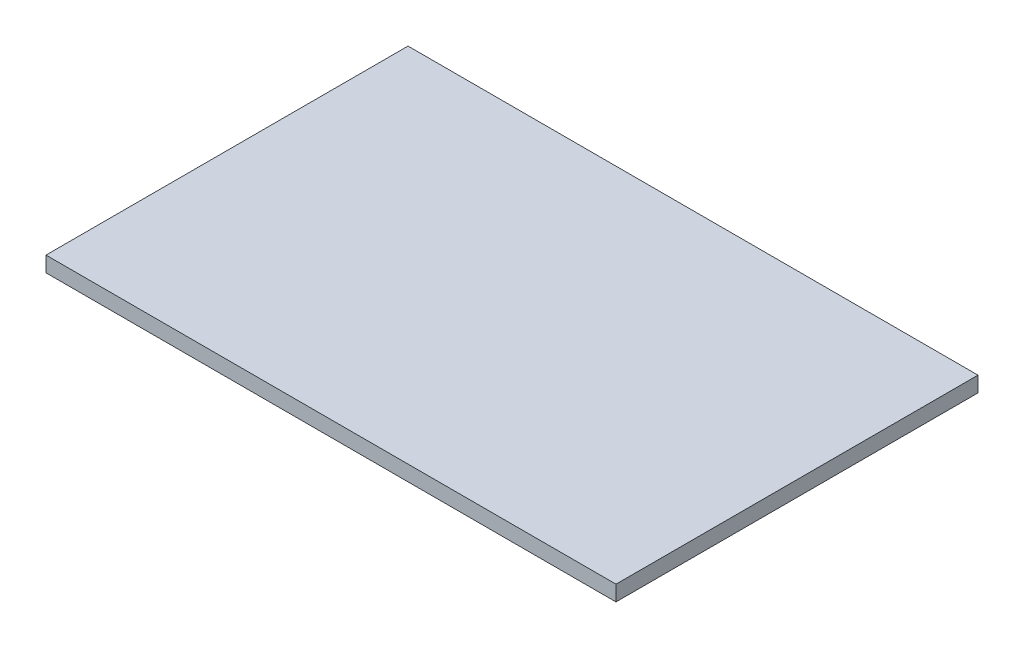
ISO-10303-21;
HEADER;
FILE_DESCRIPTION(('STEP AP214'),'2;1');
FILE_NAME('part.step','',(''),(''),'','','');
FILE_SCHEMA(('AUTOMOTIVE_DESIGN { 1 0 10303 214 1 1 1 1 }'));
ENDSEC;
DATA;
#1=APPLICATION_CONTEXT('core data for automotive mechanical design processes');
#2=APPLICATION_PROTOCOL_DEFINITION('international standard','automotive_design',2000,#1);
#3=PRODUCT_CONTEXT('',#1,'mechanical');
#4=PRODUCT('Part','Part','',(#3));
#5=PRODUCT_RELATED_PRODUCT_CATEGORY('part','',(#4));
#6=PRODUCT_DEFINITION_FORMATION('','',#4);
#7=PRODUCT_DEFINITION_CONTEXT('part definition',#1,'design');
#8=PRODUCT_DEFINITION('design','',#6,#7);
#9=PRODUCT_DEFINITION_SHAPE('','',#8);
#10=(LENGTH_UNIT() NAMED_UNIT(*) SI_UNIT(.MILLI.,.METRE.));
#11=(NAMED_UNIT(*) PLANE_ANGLE_UNIT() SI_UNIT($,.RADIAN.));
#12=(NAMED_UNIT(*) SI_UNIT($,.STERADIAN.) SOLID_ANGLE_UNIT());
#13=UNCERTAINTY_MEASURE_WITH_UNIT(LENGTH_MEASURE(1.E-05),#10,'distance_accuracy_value','');
#14=(GEOMETRIC_REPRESENTATION_CONTEXT(3) GLOBAL_UNCERTAINTY_ASSIGNED_CONTEXT((#13)) GLOBAL_UNIT_ASSIGNED_CONTEXT((#10,
#11,#12)) REPRESENTATION_CONTEXT('',''));
#15=CARTESIAN_POINT('',(0.,0.,0.));
#16=DIRECTION('',(0.,0.,1.));
#17=DIRECTION('',(1.,0.,0.));
#18=AXIS2_PLACEMENT_3D('',#15,#16,#17);
#19=CARTESIAN_POINT('',(-370.,20.,235.));
#20=DIRECTION('',(1.,0.,0.));
#21=DIRECTION('',(0.,0.,-1.));
#22=AXIS2_PLACEMENT_3D('',#19,#20,#21);
#23=PLANE('',#22);
#24=DIRECTION('',(0.,0.,1.));
#25=VECTOR('',#24,1.);
#26=CARTESIAN_POINT('',(-370.,0.,235.));
#27=LINE('',#26,#25);
#28=CARTESIAN_POINT('',(-370.,0.,-235.));
#29=VERTEX_POINT('',#28);
#30=CARTESIAN_POINT('',(-370.,0.,235.));
#31=VERTEX_POINT('',#30);
#32=EDGE_CURVE('E96',#29,#31,#27,.T.);
#33=ORIENTED_EDGE('',*,*,#32,.T.);
#34=DIRECTION('',(0.,-1.,0.));
#35=VECTOR('',#34,1.);
#36=CARTESIAN_POINT('',(-370.,20.,235.));
#37=LINE('',#36,#35);
#38=CARTESIAN_POINT('',(-370.,20.,235.));
#39=VERTEX_POINT('',#38);
#40=EDGE_CURVE('E11',#39,#31,#37,.T.);
#41=ORIENTED_EDGE('',*,*,#40,.F.);
#42=DIRECTION('',(0.,0.,1.));
#43=VECTOR('',#42,1.);
#44=CARTESIAN_POINT('',(-370.,20.,235.));
#45=LINE('',#44,#43);
#46=CARTESIAN_POINT('',(-370.,20.,-235.));
#47=VERTEX_POINT('',#46);
#48=EDGE_CURVE('E84',#47,#39,#45,.T.);
#49=ORIENTED_EDGE('',*,*,#48,.F.);
#50=DIRECTION('',(0.,-1.,0.));
#51=VECTOR('',#50,1.);
#52=CARTESIAN_POINT('',(-370.,20.,-235.));
#53=LINE('',#52,#51);
#54=EDGE_CURVE('E92',#47,#29,#53,.T.);
#55=ORIENTED_EDGE('',*,*,#54,.T.);
#56=EDGE_LOOP('',(#33,#41,#49,#55));
#57=FACE_BOUND('',#56,.T.);
#58=ADVANCED_FACE('F33',(#57),#23,.F.);
#59=CARTESIAN_POINT('',(370.,20.,235.));
#60=DIRECTION('',(0.,0.,-1.));
#61=DIRECTION('',(-1.,0.,0.));
#62=AXIS2_PLACEMENT_3D('',#59,#60,#61);
#63=PLANE('',#62);
#64=DIRECTION('',(1.,0.,0.));
#65=VECTOR('',#64,1.);
#66=CARTESIAN_POINT('',(370.,0.,235.));
#67=LINE('',#66,#65);
#68=CARTESIAN_POINT('',(370.,0.,235.));
#69=VERTEX_POINT('',#68);
#70=EDGE_CURVE('E88',#31,#69,#67,.T.);
#71=ORIENTED_EDGE('',*,*,#70,.T.);
#72=DIRECTION('',(0.,-1.,0.));
#73=VECTOR('',#72,1.);
#74=CARTESIAN_POINT('',(370.,20.,235.));
#75=LINE('',#74,#73);
#76=CARTESIAN_POINT('',(370.,20.,235.));
#77=VERTEX_POINT('',#76);
#78=EDGE_CURVE('E41',#77,#69,#75,.T.);
#79=ORIENTED_EDGE('',*,*,#78,.F.);
#80=DIRECTION('',(1.,0.,0.));
#81=VECTOR('',#80,1.);
#82=CARTESIAN_POINT('',(370.,20.,235.));
#83=LINE('',#82,#81);
#84=EDGE_CURVE('E79',#39,#77,#83,.T.);
#85=ORIENTED_EDGE('',*,*,#84,.F.);
#86=ORIENTED_EDGE('',*,*,#40,.T.);
#87=EDGE_LOOP('',(#71,#79,#85,#86));
#88=FACE_BOUND('',#87,.T.);
#89=ADVANCED_FACE('F87',(#88),#63,.F.);
#90=CARTESIAN_POINT('',(370.,20.,235.));
#91=DIRECTION('',(-1.,0.,0.));
#92=DIRECTION('',(0.,0.,1.));
#93=AXIS2_PLACEMENT_3D('',#90,#91,#92);
#94=PLANE('',#93);
#95=DIRECTION('',(0.,0.,-1.));
#96=VECTOR('',#95,1.);
#97=CARTESIAN_POINT('',(370.,0.,235.));
#98=LINE('',#97,#96);
#99=CARTESIAN_POINT('',(370.,0.,-235.));
#100=VERTEX_POINT('',#99);
#101=EDGE_CURVE('E66',#69,#100,#98,.T.);
#102=ORIENTED_EDGE('',*,*,#101,.T.);
#103=DIRECTION('',(0.,-1.,0.));
#104=VECTOR('',#103,1.);
#105=CARTESIAN_POINT('',(370.,20.,-235.));
#106=LINE('',#105,#104);
#107=CARTESIAN_POINT('',(370.,20.,-235.));
#108=VERTEX_POINT('',#107);
#109=EDGE_CURVE('E89',#108,#100,#106,.T.);
#110=ORIENTED_EDGE('',*,*,#109,.F.);
#111=DIRECTION('',(0.,0.,-1.));
#112=VECTOR('',#111,1.);
#113=CARTESIAN_POINT('',(370.,20.,235.));
#114=LINE('',#113,#112);
#115=EDGE_CURVE('E82',#77,#108,#114,.T.);
#116=ORIENTED_EDGE('',*,*,#115,.F.);
#117=ORIENTED_EDGE('',*,*,#78,.T.);
#118=EDGE_LOOP('',(#102,#110,#116,#117));
#119=FACE_BOUND('',#118,.T.);
#120=ADVANCED_FACE('F90',(#119),#94,.F.);
#121=CARTESIAN_POINT('',(370.,20.,-235.));
#122=DIRECTION('',(0.,0.,1.));
#123=DIRECTION('',(1.,0.,0.));
#124=AXIS2_PLACEMENT_3D('',#121,#122,#123);
#125=PLANE('',#124);
#126=DIRECTION('',(-1.,0.,0.));
#127=VECTOR('',#126,1.);
#128=CARTESIAN_POINT('',(370.,0.,-235.));
#129=LINE('',#128,#127);
#130=EDGE_CURVE('E72',#100,#29,#129,.T.);
#131=ORIENTED_EDGE('',*,*,#130,.T.);
#132=ORIENTED_EDGE('',*,*,#54,.F.);
#133=DIRECTION('',(-1.,0.,0.));
#134=VECTOR('',#133,1.);
#135=CARTESIAN_POINT('',(370.,20.,-235.));
#136=LINE('',#135,#134);
#137=EDGE_CURVE('E49',#108,#47,#136,.T.);
#138=ORIENTED_EDGE('',*,*,#137,.F.);
#139=ORIENTED_EDGE('',*,*,#109,.T.);
#140=EDGE_LOOP('',(#131,#132,#138,#139));
#141=FACE_BOUND('',#140,.T.);
#142=ADVANCED_FACE('F103',(#141),#125,.F.);
#143=CARTESIAN_POINT('',(0.,20.,0.));
#144=DIRECTION('',(0.,1.,0.));
#145=DIRECTION('',(0.,0.,1.));
#146=AXIS2_PLACEMENT_3D('',#143,#144,#145);
#147=PLANE('',#146);
#148=ORIENTED_EDGE('',*,*,#48,.T.);
#149=ORIENTED_EDGE('',*,*,#84,.T.);
#150=ORIENTED_EDGE('',*,*,#115,.T.);
#151=ORIENTED_EDGE('',*,*,#137,.T.);
#152=EDGE_LOOP('',(#148,#149,#150,#151));
#153=FACE_BOUND('',#152,.T.);
#154=ADVANCED_FACE('F80',(#153),#147,.T.);
#155=CARTESIAN_POINT('',(0.,0.,0.));
#156=DIRECTION('',(0.,1.,0.));
#157=DIRECTION('',(0.,0.,1.));
#158=AXIS2_PLACEMENT_3D('',#155,#156,#157);
#159=PLANE('',#158);
#160=ORIENTED_EDGE('',*,*,#32,.F.);
#161=ORIENTED_EDGE('',*,*,#130,.F.);
#162=ORIENTED_EDGE('',*,*,#101,.F.);
#163=ORIENTED_EDGE('',*,*,#70,.F.);
#164=EDGE_LOOP('',(#160,#161,#162,#163));
#165=FACE_BOUND('',#164,.T.);
#166=ADVANCED_FACE('F106',(#165),#159,.F.);
#167=CLOSED_SHELL('',(#58,#89,#120,#142,#154,#166));
#168=MANIFOLD_SOLID_BREP('B2',#167);
#169=ADVANCED_BREP_SHAPE_REPRESENTATION('',(#18,#168),#14);
#170=SHAPE_DEFINITION_REPRESENTATION(#9,#169);
ENDSEC;
END-ISO-10303-21;
